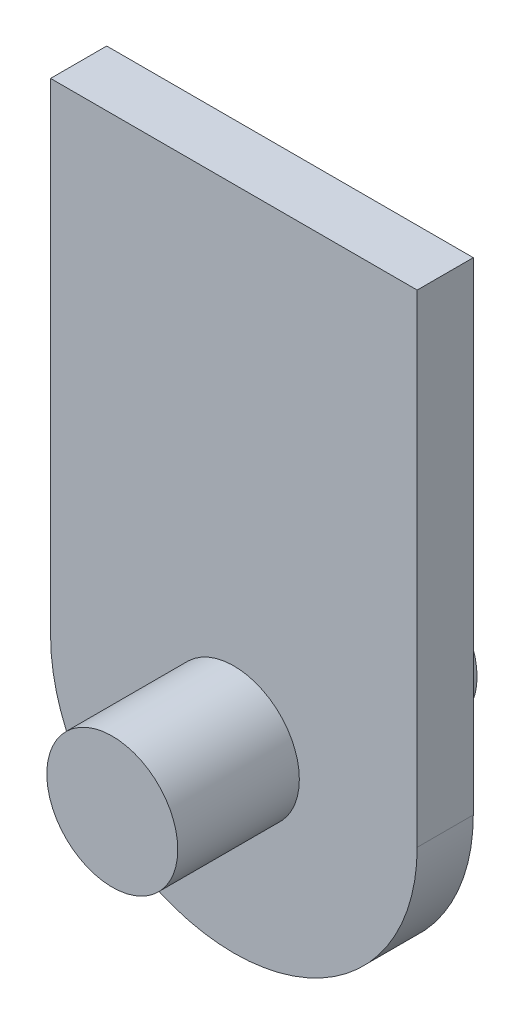
ISO-10303-21;
HEADER;
FILE_DESCRIPTION(('STEP AP214'),'2;1');
FILE_NAME('part.step','',(''),(''),'','','');
FILE_SCHEMA(('AUTOMOTIVE_DESIGN { 1 0 10303 214 1 1 1 1 }'));
ENDSEC;
DATA;
#1=APPLICATION_CONTEXT('core data for automotive mechanical design processes');
#2=APPLICATION_PROTOCOL_DEFINITION('international standard','automotive_design',2000,#1);
#3=PRODUCT_CONTEXT('',#1,'mechanical');
#4=PRODUCT('Part','Part','',(#3));
#5=PRODUCT_RELATED_PRODUCT_CATEGORY('part','',(#4));
#6=PRODUCT_DEFINITION_FORMATION('','',#4);
#7=PRODUCT_DEFINITION_CONTEXT('part definition',#1,'design');
#8=PRODUCT_DEFINITION('design','',#6,#7);
#9=PRODUCT_DEFINITION_SHAPE('','',#8);
#10=(LENGTH_UNIT() NAMED_UNIT(*) SI_UNIT(.MILLI.,.METRE.));
#11=(NAMED_UNIT(*) PLANE_ANGLE_UNIT() SI_UNIT($,.RADIAN.));
#12=(NAMED_UNIT(*) SI_UNIT($,.STERADIAN.) SOLID_ANGLE_UNIT());
#13=UNCERTAINTY_MEASURE_WITH_UNIT(LENGTH_MEASURE(1.E-05),#10,'distance_accuracy_value','');
#14=(GEOMETRIC_REPRESENTATION_CONTEXT(3) GLOBAL_UNCERTAINTY_ASSIGNED_CONTEXT((#13)) GLOBAL_UNIT_ASSIGNED_CONTEXT((#10,
#11,#12)) REPRESENTATION_CONTEXT('',''));
#15=CARTESIAN_POINT('',(0.,0.,0.));
#16=DIRECTION('',(0.,0.,1.));
#17=DIRECTION('',(1.,0.,0.));
#18=AXIS2_PLACEMENT_3D('',#15,#16,#17);
#19=CARTESIAN_POINT('',(14.7915555422025,13.6634638244499,1.190625));
#20=DIRECTION('',(0.,0.,1.));
#21=DIRECTION('',(1.,0.,0.));
#22=AXIS2_PLACEMENT_3D('',#19,#20,#21);
#23=PLANE('',#22);
#24=CARTESIAN_POINT('',(14.7915555422025,13.6634638244499,1.190625));
#25=DIRECTION('',(0.,0.,1.));
#26=DIRECTION('',(1.,0.,0.));
#27=AXIS2_PLACEMENT_3D('',#24,#25,#26);
#28=CIRCLE('',#27,7.77712993333658);
#29=CARTESIAN_POINT('',(7.01442560886592,13.6634638244499,1.190625));
#30=VERTEX_POINT('',#29);
#31=CARTESIAN_POINT('',(22.5686854755391,13.6634638244499,1.190625));
#32=VERTEX_POINT('',#31);
#33=EDGE_CURVE('E86',#30,#32,#28,.T.);
#34=ORIENTED_EDGE('',*,*,#33,.T.);
#35=DIRECTION('',(0.,1.,0.));
#36=VECTOR('',#35,1.);
#37=CARTESIAN_POINT('',(22.5686854755391,13.6634638244499,1.190625));
#38=LINE('',#37,#36);
#39=CARTESIAN_POINT('',(22.5686854755391,34.1405937577865,1.190625));
#40=VERTEX_POINT('',#39);
#41=EDGE_CURVE('E81',#32,#40,#38,.T.);
#42=ORIENTED_EDGE('',*,*,#41,.T.);
#43=DIRECTION('',(-1.,0.,0.));
#44=VECTOR('',#43,1.);
#45=CARTESIAN_POINT('',(7.01442560886592,34.1405937577865,1.190625));
#46=LINE('',#45,#44);
#47=CARTESIAN_POINT('',(7.01442560886592,34.1405937577865,1.190625));
#48=VERTEX_POINT('',#47);
#49=EDGE_CURVE('E84',#40,#48,#46,.T.);
#50=ORIENTED_EDGE('',*,*,#49,.T.);
#51=DIRECTION('',(0.,-1.,0.));
#52=VECTOR('',#51,1.);
#53=CARTESIAN_POINT('',(7.01442560886592,13.6634638244499,1.190625));
#54=LINE('',#53,#52);
#55=EDGE_CURVE('E50',#48,#30,#54,.T.);
#56=ORIENTED_EDGE('',*,*,#55,.T.);
#57=EDGE_LOOP('',(#34,#42,#50,#56));
#58=FACE_BOUND('',#57,.T.);
#59=CARTESIAN_POINT('',(14.7915555422025,13.6634638244499,1.190625));
#60=DIRECTION('',(0.,0.,1.));
#61=DIRECTION('',(1.,0.,0.));
#62=AXIS2_PLACEMENT_3D('',#59,#60,#61);
#63=CIRCLE('',#62,2.778125);
#64=CARTESIAN_POINT('',(17.5696805422025,13.6634638244499,1.190625));
#65=VERTEX_POINT('',#64);
#66=EDGE_CURVE('E103',#65,#65,#63,.F.);
#67=ORIENTED_EDGE('',*,*,#66,.T.);
#68=EDGE_LOOP('',(#67));
#69=FACE_BOUND('',#68,.T.);
#70=ADVANCED_FACE('F33',(#58,#69),#23,.T.);
#71=CARTESIAN_POINT('',(14.7915555422025,13.6634638244499,-1.190625));
#72=DIRECTION('',(0.,0.,1.));
#73=DIRECTION('',(1.,0.,0.));
#74=AXIS2_PLACEMENT_3D('',#71,#72,#73);
#75=PLANE('',#74);
#76=CARTESIAN_POINT('',(14.7915555422025,13.6634638244499,-1.190625));
#77=DIRECTION('',(0.,0.,1.));
#78=DIRECTION('',(1.,0.,0.));
#79=AXIS2_PLACEMENT_3D('',#76,#77,#78);
#80=CIRCLE('',#79,7.77712993333658);
#81=CARTESIAN_POINT('',(7.01442560886592,13.6634638244499,-1.190625));
#82=VERTEX_POINT('',#81);
#83=CARTESIAN_POINT('',(22.5686854755391,13.6634638244499,-1.190625));
#84=VERTEX_POINT('',#83);
#85=EDGE_CURVE('E100',#82,#84,#80,.T.);
#86=ORIENTED_EDGE('',*,*,#85,.F.);
#87=DIRECTION('',(0.,-1.,0.));
#88=VECTOR('',#87,1.);
#89=CARTESIAN_POINT('',(7.01442560886592,13.6634638244499,-1.190625));
#90=LINE('',#89,#88);
#91=CARTESIAN_POINT('',(7.01442560886592,34.1405937577865,-1.190625));
#92=VERTEX_POINT('',#91);
#93=EDGE_CURVE('E73',#92,#82,#90,.T.);
#94=ORIENTED_EDGE('',*,*,#93,.F.);
#95=DIRECTION('',(-1.,0.,0.));
#96=VECTOR('',#95,1.);
#97=CARTESIAN_POINT('',(7.01442560886592,34.1405937577865,-1.190625));
#98=LINE('',#97,#96);
#99=CARTESIAN_POINT('',(22.5686854755391,34.1405937577865,-1.190625));
#100=VERTEX_POINT('',#99);
#101=EDGE_CURVE('E67',#100,#92,#98,.T.);
#102=ORIENTED_EDGE('',*,*,#101,.F.);
#103=DIRECTION('',(0.,1.,0.));
#104=VECTOR('',#103,1.);
#105=CARTESIAN_POINT('',(22.5686854755391,13.6634638244499,-1.190625));
#106=LINE('',#105,#104);
#107=EDGE_CURVE('E91',#84,#100,#106,.T.);
#108=ORIENTED_EDGE('',*,*,#107,.F.);
#109=EDGE_LOOP('',(#86,#94,#102,#108));
#110=FACE_BOUND('',#109,.T.);
#111=CARTESIAN_POINT('',(14.7915555422025,13.6634638244499,-1.190625));
#112=DIRECTION('',(0.,0.,1.));
#113=DIRECTION('',(1.,0.,0.));
#114=AXIS2_PLACEMENT_3D('',#111,#112,#113);
#115=CIRCLE('',#114,2.778125);
#116=CARTESIAN_POINT('',(17.5696805422025,13.6634638244499,-1.190625));
#117=VERTEX_POINT('',#116);
#118=EDGE_CURVE('E11',#117,#117,#115,.F.);
#119=ORIENTED_EDGE('',*,*,#118,.F.);
#120=EDGE_LOOP('',(#119));
#121=FACE_BOUND('',#120,.T.);
#122=ADVANCED_FACE('F111',(#110,#121),#75,.F.);
#123=CARTESIAN_POINT('',(14.7915555422025,13.6634638244499,1.190625));
#124=DIRECTION('',(0.,0.,-1.));
#125=DIRECTION('',(-1.,0.,0.));
#126=AXIS2_PLACEMENT_3D('',#123,#124,#125);
#127=CYLINDRICAL_SURFACE('',#126,7.77712993333658);
#128=ORIENTED_EDGE('',*,*,#85,.T.);
#129=DIRECTION('',(0.,0.,-1.));
#130=VECTOR('',#129,1.);
#131=CARTESIAN_POINT('',(22.5686854755391,13.6634638244499,1.190625));
#132=LINE('',#131,#130);
#133=EDGE_CURVE('E42',#32,#84,#132,.T.);
#134=ORIENTED_EDGE('',*,*,#133,.F.);
#135=ORIENTED_EDGE('',*,*,#33,.F.);
#136=DIRECTION('',(0.,0.,-1.));
#137=VECTOR('',#136,1.);
#138=CARTESIAN_POINT('',(7.01442560886592,13.6634638244499,1.190625));
#139=LINE('',#138,#137);
#140=EDGE_CURVE('E96',#30,#82,#139,.T.);
#141=ORIENTED_EDGE('',*,*,#140,.T.);
#142=EDGE_LOOP('',(#128,#134,#135,#141));
#143=FACE_BOUND('',#142,.T.);
#144=ADVANCED_FACE('F35',(#143),#127,.T.);
#145=CARTESIAN_POINT('',(22.5686854755391,13.6634638244499,1.190625));
#146=DIRECTION('',(-1.,0.,0.));
#147=DIRECTION('',(0.,0.,1.));
#148=AXIS2_PLACEMENT_3D('',#145,#146,#147);
#149=PLANE('',#148);
#150=ORIENTED_EDGE('',*,*,#107,.T.);
#151=DIRECTION('',(0.,0.,-1.));
#152=VECTOR('',#151,1.);
#153=CARTESIAN_POINT('',(22.5686854755391,34.1405937577865,1.190625));
#154=LINE('',#153,#152);
#155=EDGE_CURVE('E89',#40,#100,#154,.T.);
#156=ORIENTED_EDGE('',*,*,#155,.F.);
#157=ORIENTED_EDGE('',*,*,#41,.F.);
#158=ORIENTED_EDGE('',*,*,#133,.T.);
#159=EDGE_LOOP('',(#150,#156,#157,#158));
#160=FACE_BOUND('',#159,.T.);
#161=ADVANCED_FACE('F90',(#160),#149,.F.);
#162=CARTESIAN_POINT('',(7.01442560886592,34.1405937577865,1.190625));
#163=DIRECTION('',(0.,-1.,0.));
#164=DIRECTION('',(0.,0.,-1.));
#165=AXIS2_PLACEMENT_3D('',#162,#163,#164);
#166=PLANE('',#165);
#167=ORIENTED_EDGE('',*,*,#101,.T.);
#168=DIRECTION('',(0.,0.,-1.));
#169=VECTOR('',#168,1.);
#170=CARTESIAN_POINT('',(7.01442560886592,34.1405937577865,1.190625));
#171=LINE('',#170,#169);
#172=EDGE_CURVE('E92',#48,#92,#171,.T.);
#173=ORIENTED_EDGE('',*,*,#172,.F.);
#174=ORIENTED_EDGE('',*,*,#49,.F.);
#175=ORIENTED_EDGE('',*,*,#155,.T.);
#176=EDGE_LOOP('',(#167,#173,#174,#175));
#177=FACE_BOUND('',#176,.T.);
#178=ADVANCED_FACE('F94',(#177),#166,.F.);
#179=CARTESIAN_POINT('',(7.01442560886592,13.6634638244499,1.190625));
#180=DIRECTION('',(1.,0.,0.));
#181=DIRECTION('',(0.,0.,-1.));
#182=AXIS2_PLACEMENT_3D('',#179,#180,#181);
#183=PLANE('',#182);
#184=ORIENTED_EDGE('',*,*,#93,.T.);
#185=ORIENTED_EDGE('',*,*,#140,.F.);
#186=ORIENTED_EDGE('',*,*,#55,.F.);
#187=ORIENTED_EDGE('',*,*,#172,.T.);
#188=EDGE_LOOP('',(#184,#185,#186,#187));
#189=FACE_BOUND('',#188,.T.);
#190=ADVANCED_FACE('F129',(#189),#183,.F.);
#191=CARTESIAN_POINT('',(14.7915555422025,13.6634638244499,-6.35));
#192=DIRECTION('',(0.,0.,1.));
#193=DIRECTION('',(1.,0.,0.));
#194=AXIS2_PLACEMENT_3D('',#191,#192,#193);
#195=PLANE('',#194);
#196=CARTESIAN_POINT('',(14.7915555422025,13.6634638244499,-6.35));
#197=DIRECTION('',(0.,0.,1.));
#198=DIRECTION('',(1.,0.,0.));
#199=AXIS2_PLACEMENT_3D('',#196,#197,#198);
#200=CIRCLE('',#199,2.778125);
#201=CARTESIAN_POINT('',(17.5696805422025,13.6634638244499,-6.35));
#202=VERTEX_POINT('',#201);
#203=EDGE_CURVE('E188',#202,#202,#200,.T.);
#204=ORIENTED_EDGE('',*,*,#203,.F.);
#205=EDGE_LOOP('',(#204));
#206=FACE_BOUND('',#205,.T.);
#207=ADVANCED_FACE('F120',(#206),#195,.F.);
#208=CARTESIAN_POINT('',(14.7915555422025,13.6634638244499,6.35));
#209=DIRECTION('',(0.,0.,-1.));
#210=DIRECTION('',(-1.,0.,0.));
#211=AXIS2_PLACEMENT_3D('',#208,#209,#210);
#212=CYLINDRICAL_SURFACE('',#211,2.778125);
#213=ORIENTED_EDGE('',*,*,#203,.T.);
#214=EDGE_LOOP('',(#213));
#215=FACE_BOUND('',#214,.T.);
#216=ORIENTED_EDGE('',*,*,#118,.T.);
#217=EDGE_LOOP('',(#216));
#218=FACE_BOUND('',#217,.T.);
#219=ADVANCED_FACE('F117',(#215,#218),#212,.T.);
#220=ORIENTED_EDGE('',*,*,#66,.F.);
#221=EDGE_LOOP('',(#220));
#222=FACE_BOUND('',#221,.T.);
#223=CARTESIAN_POINT('',(14.7915555422025,13.6634638244499,6.35));
#224=DIRECTION('',(0.,0.,1.));
#225=DIRECTION('',(1.,0.,0.));
#226=AXIS2_PLACEMENT_3D('',#223,#224,#225);
#227=CIRCLE('',#226,2.778125);
#228=CARTESIAN_POINT('',(17.5696805422025,13.6634638244499,6.35));
#229=VERTEX_POINT('',#228);
#230=EDGE_CURVE('E186',#229,#229,#227,.T.);
#231=ORIENTED_EDGE('',*,*,#230,.F.);
#232=EDGE_LOOP('',(#231));
#233=FACE_BOUND('',#232,.T.);
#234=ADVANCED_FACE('F119',(#222,#233),#212,.T.);
#235=CARTESIAN_POINT('',(14.7915555422025,13.6634638244499,6.35));
#236=DIRECTION('',(0.,0.,1.));
#237=DIRECTION('',(1.,0.,0.));
#238=AXIS2_PLACEMENT_3D('',#235,#236,#237);
#239=PLANE('',#238);
#240=ORIENTED_EDGE('',*,*,#230,.T.);
#241=EDGE_LOOP('',(#240));
#242=FACE_BOUND('',#241,.T.);
#243=ADVANCED_FACE('F127',(#242),#239,.T.);
#244=CLOSED_SHELL('',(#70,#122,#144,#161,#178,#190,#207,#219,#234,#243));
#245=MANIFOLD_SOLID_BREP('B2',#244);
#246=ADVANCED_BREP_SHAPE_REPRESENTATION('',(#18,#245),#14);
#247=SHAPE_DEFINITION_REPRESENTATION(#9,#246);
ENDSEC;
END-ISO-10303-21;
